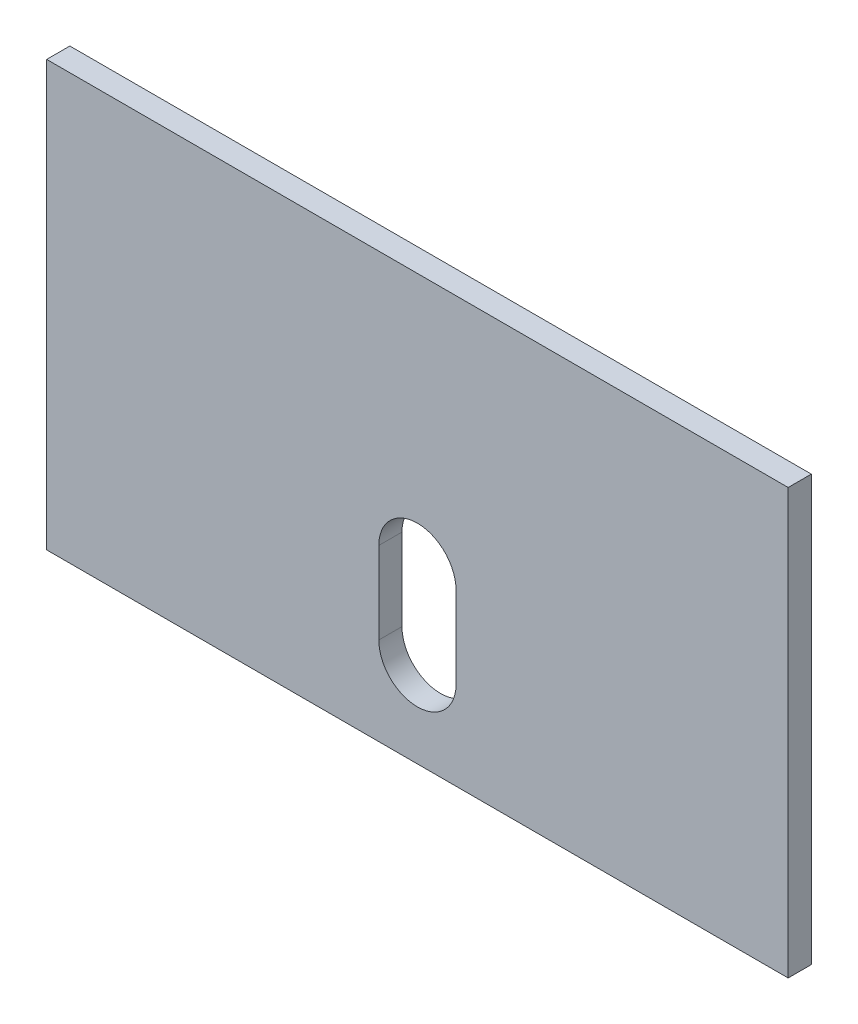
ISO-10303-21;
HEADER;
FILE_DESCRIPTION(('STEP AP214'),'2;1');
FILE_NAME('part.step','',(''),(''),'','','');
FILE_SCHEMA(('AUTOMOTIVE_DESIGN { 1 0 10303 214 1 1 1 1 }'));
ENDSEC;
DATA;
#1=APPLICATION_CONTEXT('core data for automotive mechanical design processes');
#2=APPLICATION_PROTOCOL_DEFINITION('international standard','automotive_design',2000,#1);
#3=PRODUCT_CONTEXT('',#1,'mechanical');
#4=PRODUCT('Part','Part','',(#3));
#5=PRODUCT_RELATED_PRODUCT_CATEGORY('part','',(#4));
#6=PRODUCT_DEFINITION_FORMATION('','',#4);
#7=PRODUCT_DEFINITION_CONTEXT('part definition',#1,'design');
#8=PRODUCT_DEFINITION('design','',#6,#7);
#9=PRODUCT_DEFINITION_SHAPE('','',#8);
#10=(LENGTH_UNIT() NAMED_UNIT(*) SI_UNIT(.MILLI.,.METRE.));
#11=(NAMED_UNIT(*) PLANE_ANGLE_UNIT() SI_UNIT($,.RADIAN.));
#12=(NAMED_UNIT(*) SI_UNIT($,.STERADIAN.) SOLID_ANGLE_UNIT());
#13=UNCERTAINTY_MEASURE_WITH_UNIT(LENGTH_MEASURE(1.E-05),#10,'distance_accuracy_value','');
#14=(GEOMETRIC_REPRESENTATION_CONTEXT(3) GLOBAL_UNCERTAINTY_ASSIGNED_CONTEXT((#13)) GLOBAL_UNIT_ASSIGNED_CONTEXT((#10,
#11,#12)) REPRESENTATION_CONTEXT('',''));
#15=CARTESIAN_POINT('',(0.,0.,0.));
#16=DIRECTION('',(0.,0.,1.));
#17=DIRECTION('',(1.,0.,0.));
#18=AXIS2_PLACEMENT_3D('',#15,#16,#17);
#19=CARTESIAN_POINT('',(0.,0.,1.5));
#20=DIRECTION('',(0.,0.,1.));
#21=DIRECTION('',(1.,0.,0.));
#22=AXIS2_PLACEMENT_3D('',#19,#20,#21);
#23=PLANE('',#22);
#24=DIRECTION('',(0.,-1.,0.));
#25=VECTOR('',#24,1.);
#26=CARTESIAN_POINT('',(-48.,-27.5,1.5));
#27=LINE('',#26,#25);
#28=CARTESIAN_POINT('',(-48.,27.5,1.5));
#29=VERTEX_POINT('',#28);
#30=CARTESIAN_POINT('',(-48.,-27.5,1.5));
#31=VERTEX_POINT('',#30);
#32=EDGE_CURVE('E163',#29,#31,#27,.T.);
#33=ORIENTED_EDGE('',*,*,#32,.T.);
#34=DIRECTION('',(1.,0.,0.));
#35=VECTOR('',#34,1.);
#36=CARTESIAN_POINT('',(48.,-27.5,1.5));
#37=LINE('',#36,#35);
#38=CARTESIAN_POINT('',(48.,-27.5,1.5));
#39=VERTEX_POINT('',#38);
#40=EDGE_CURVE('E167',#31,#39,#37,.T.);
#41=ORIENTED_EDGE('',*,*,#40,.T.);
#42=DIRECTION('',(0.,1.,0.));
#43=VECTOR('',#42,1.);
#44=CARTESIAN_POINT('',(48.,-27.5,1.5));
#45=LINE('',#44,#43);
#46=CARTESIAN_POINT('',(48.,27.5,1.5));
#47=VERTEX_POINT('',#46);
#48=EDGE_CURVE('E171',#39,#47,#45,.T.);
#49=ORIENTED_EDGE('',*,*,#48,.T.);
#50=DIRECTION('',(-1.,0.,0.));
#51=VECTOR('',#50,1.);
#52=CARTESIAN_POINT('',(48.,27.5,1.5));
#53=LINE('',#52,#51);
#54=EDGE_CURVE('E174',#47,#29,#53,.T.);
#55=ORIENTED_EDGE('',*,*,#54,.T.);
#56=EDGE_LOOP('',(#33,#41,#49,#55));
#57=FACE_BOUND('',#56,.T.);
#58=DIRECTION('',(0.,1.,0.));
#59=VECTOR('',#58,1.);
#60=CARTESIAN_POINT('',(5.,-16.1,1.5));
#61=LINE('',#60,#59);
#62=CARTESIAN_POINT('',(5.,-16.1,1.5));
#63=VERTEX_POINT('',#62);
#64=CARTESIAN_POINT('',(5.,-5.50000000000001,1.5));
#65=VERTEX_POINT('',#64);
#66=EDGE_CURVE('E123',#63,#65,#61,.T.);
#67=ORIENTED_EDGE('',*,*,#66,.F.);
#68=CARTESIAN_POINT('',(0.,-16.1,1.5));
#69=DIRECTION('',(0.,0.,1.));
#70=DIRECTION('',(1.,0.,0.));
#71=AXIS2_PLACEMENT_3D('',#68,#69,#70);
#72=CIRCLE('',#71,5.);
#73=CARTESIAN_POINT('',(-5.,-16.1,1.5));
#74=VERTEX_POINT('',#73);
#75=EDGE_CURVE('E114',#74,#63,#72,.T.);
#76=ORIENTED_EDGE('',*,*,#75,.F.);
#77=DIRECTION('',(0.,-1.,0.));
#78=VECTOR('',#77,1.);
#79=CARTESIAN_POINT('',(-5.,-16.1,1.5));
#80=LINE('',#79,#78);
#81=CARTESIAN_POINT('',(-5.,-5.50000000000001,1.5));
#82=VERTEX_POINT('',#81);
#83=EDGE_CURVE('E141',#82,#74,#80,.T.);
#84=ORIENTED_EDGE('',*,*,#83,.F.);
#85=CARTESIAN_POINT('',(0.,-5.50000000000001,1.5));
#86=DIRECTION('',(0.,0.,1.));
#87=DIRECTION('',(1.,0.,0.));
#88=AXIS2_PLACEMENT_3D('',#85,#86,#87);
#89=CIRCLE('',#88,5.);
#90=EDGE_CURVE('E136',#65,#82,#89,.T.);
#91=ORIENTED_EDGE('',*,*,#90,.F.);
#92=EDGE_LOOP('',(#67,#76,#84,#91));
#93=FACE_BOUND('',#92,.T.);
#94=ADVANCED_FACE('F48',(#57,#93),#23,.T.);
#95=CARTESIAN_POINT('',(0.,0.,-1.5));
#96=DIRECTION('',(0.,0.,1.));
#97=DIRECTION('',(1.,0.,0.));
#98=AXIS2_PLACEMENT_3D('',#95,#96,#97);
#99=PLANE('',#98);
#100=DIRECTION('',(0.,-1.,0.));
#101=VECTOR('',#100,1.);
#102=CARTESIAN_POINT('',(-48.,-27.5,-1.5));
#103=LINE('',#102,#101);
#104=CARTESIAN_POINT('',(-48.,27.5,-1.5));
#105=VERTEX_POINT('',#104);
#106=CARTESIAN_POINT('',(-48.,-27.5,-1.5));
#107=VERTEX_POINT('',#106);
#108=EDGE_CURVE('E132',#105,#107,#103,.T.);
#109=ORIENTED_EDGE('',*,*,#108,.F.);
#110=DIRECTION('',(-1.,0.,0.));
#111=VECTOR('',#110,1.);
#112=CARTESIAN_POINT('',(48.,27.5,-1.5));
#113=LINE('',#112,#111);
#114=CARTESIAN_POINT('',(48.,27.5,-1.5));
#115=VERTEX_POINT('',#114);
#116=EDGE_CURVE('E168',#115,#105,#113,.T.);
#117=ORIENTED_EDGE('',*,*,#116,.F.);
#118=DIRECTION('',(0.,1.,0.));
#119=VECTOR('',#118,1.);
#120=CARTESIAN_POINT('',(48.,-27.5,-1.5));
#121=LINE('',#120,#119);
#122=CARTESIAN_POINT('',(48.,-27.5,-1.5));
#123=VERTEX_POINT('',#122);
#124=EDGE_CURVE('E184',#123,#115,#121,.T.);
#125=ORIENTED_EDGE('',*,*,#124,.F.);
#126=DIRECTION('',(1.,0.,0.));
#127=VECTOR('',#126,1.);
#128=CARTESIAN_POINT('',(48.,-27.5,-1.5));
#129=LINE('',#128,#127);
#130=EDGE_CURVE('E181',#107,#123,#129,.T.);
#131=ORIENTED_EDGE('',*,*,#130,.F.);
#132=EDGE_LOOP('',(#109,#117,#125,#131));
#133=FACE_BOUND('',#132,.T.);
#134=CARTESIAN_POINT('',(0.,-16.1,-1.5));
#135=DIRECTION('',(0.,0.,1.));
#136=DIRECTION('',(1.,0.,0.));
#137=AXIS2_PLACEMENT_3D('',#134,#135,#136);
#138=CIRCLE('',#137,5.);
#139=CARTESIAN_POINT('',(-5.,-16.1,-1.5));
#140=VERTEX_POINT('',#139);
#141=CARTESIAN_POINT('',(5.,-16.1,-1.5));
#142=VERTEX_POINT('',#141);
#143=EDGE_CURVE('E72',#140,#142,#138,.T.);
#144=ORIENTED_EDGE('',*,*,#143,.T.);
#145=DIRECTION('',(0.,1.,0.));
#146=VECTOR('',#145,1.);
#147=CARTESIAN_POINT('',(5.,-16.1,-1.5));
#148=LINE('',#147,#146);
#149=CARTESIAN_POINT('',(5.,-5.50000000000001,-1.5));
#150=VERTEX_POINT('',#149);
#151=EDGE_CURVE('E130',#142,#150,#148,.T.);
#152=ORIENTED_EDGE('',*,*,#151,.T.);
#153=CARTESIAN_POINT('',(0.,-5.50000000000001,-1.5));
#154=DIRECTION('',(0.,0.,1.));
#155=DIRECTION('',(1.,0.,0.));
#156=AXIS2_PLACEMENT_3D('',#153,#154,#155);
#157=CIRCLE('',#156,5.);
#158=CARTESIAN_POINT('',(-5.,-5.50000000000001,-1.5));
#159=VERTEX_POINT('',#158);
#160=EDGE_CURVE('E150',#150,#159,#157,.T.);
#161=ORIENTED_EDGE('',*,*,#160,.T.);
#162=DIRECTION('',(0.,-1.,0.));
#163=VECTOR('',#162,1.);
#164=CARTESIAN_POINT('',(-5.,-16.1,-1.5));
#165=LINE('',#164,#163);
#166=EDGE_CURVE('E124',#159,#140,#165,.T.);
#167=ORIENTED_EDGE('',*,*,#166,.T.);
#168=EDGE_LOOP('',(#144,#152,#161,#167));
#169=FACE_BOUND('',#168,.T.);
#170=ADVANCED_FACE('F208',(#133,#169),#99,.F.);
#171=CARTESIAN_POINT('',(-48.,-27.5,1.5));
#172=DIRECTION('',(1.,0.,0.));
#173=DIRECTION('',(0.,0.,-1.));
#174=AXIS2_PLACEMENT_3D('',#171,#172,#173);
#175=PLANE('',#174);
#176=ORIENTED_EDGE('',*,*,#108,.T.);
#177=DIRECTION('',(0.,0.,-1.));
#178=VECTOR('',#177,1.);
#179=CARTESIAN_POINT('',(-48.,-27.5,1.5));
#180=LINE('',#179,#178);
#181=EDGE_CURVE('E13',#31,#107,#180,.T.);
#182=ORIENTED_EDGE('',*,*,#181,.F.);
#183=ORIENTED_EDGE('',*,*,#32,.F.);
#184=DIRECTION('',(0.,0.,-1.));
#185=VECTOR('',#184,1.);
#186=CARTESIAN_POINT('',(-48.,27.5,1.5));
#187=LINE('',#186,#185);
#188=EDGE_CURVE('E177',#29,#105,#187,.T.);
#189=ORIENTED_EDGE('',*,*,#188,.T.);
#190=EDGE_LOOP('',(#176,#182,#183,#189));
#191=FACE_BOUND('',#190,.T.);
#192=ADVANCED_FACE('F50',(#191),#175,.F.);
#193=CARTESIAN_POINT('',(48.,-27.5,1.5));
#194=DIRECTION('',(0.,1.,0.));
#195=DIRECTION('',(-1.,0.,0.));
#196=AXIS2_PLACEMENT_3D('',#193,#194,#195);
#197=PLANE('',#196);
#198=ORIENTED_EDGE('',*,*,#130,.T.);
#199=DIRECTION('',(0.,0.,-1.));
#200=VECTOR('',#199,1.);
#201=CARTESIAN_POINT('',(48.,-27.5,1.5));
#202=LINE('',#201,#200);
#203=EDGE_CURVE('E57',#39,#123,#202,.T.);
#204=ORIENTED_EDGE('',*,*,#203,.F.);
#205=ORIENTED_EDGE('',*,*,#40,.F.);
#206=ORIENTED_EDGE('',*,*,#181,.T.);
#207=EDGE_LOOP('',(#198,#204,#205,#206));
#208=FACE_BOUND('',#207,.T.);
#209=ADVANCED_FACE('F218',(#208),#197,.F.);
#210=CARTESIAN_POINT('',(48.,-27.5,1.5));
#211=DIRECTION('',(-1.,0.,0.));
#212=DIRECTION('',(0.,0.,1.));
#213=AXIS2_PLACEMENT_3D('',#210,#211,#212);
#214=PLANE('',#213);
#215=ORIENTED_EDGE('',*,*,#124,.T.);
#216=DIRECTION('',(0.,0.,-1.));
#217=VECTOR('',#216,1.);
#218=CARTESIAN_POINT('',(48.,27.5,1.5));
#219=LINE('',#218,#217);
#220=EDGE_CURVE('E192',#47,#115,#219,.T.);
#221=ORIENTED_EDGE('',*,*,#220,.F.);
#222=ORIENTED_EDGE('',*,*,#48,.F.);
#223=ORIENTED_EDGE('',*,*,#203,.T.);
#224=EDGE_LOOP('',(#215,#221,#222,#223));
#225=FACE_BOUND('',#224,.T.);
#226=ADVANCED_FACE('F202',(#225),#214,.F.);
#227=CARTESIAN_POINT('',(48.,27.5,1.5));
#228=DIRECTION('',(0.,-1.,0.));
#229=DIRECTION('',(1.,0.,0.));
#230=AXIS2_PLACEMENT_3D('',#227,#228,#229);
#231=PLANE('',#230);
#232=ORIENTED_EDGE('',*,*,#116,.T.);
#233=ORIENTED_EDGE('',*,*,#188,.F.);
#234=ORIENTED_EDGE('',*,*,#54,.F.);
#235=ORIENTED_EDGE('',*,*,#220,.T.);
#236=EDGE_LOOP('',(#232,#233,#234,#235));
#237=FACE_BOUND('',#236,.T.);
#238=ADVANCED_FACE('F212',(#237),#231,.F.);
#239=CARTESIAN_POINT('',(0.,-16.1,1.5));
#240=DIRECTION('',(0.,0.,-1.));
#241=DIRECTION('',(-1.,0.,0.));
#242=AXIS2_PLACEMENT_3D('',#239,#240,#241);
#243=CYLINDRICAL_SURFACE('',#242,5.);
#244=ORIENTED_EDGE('',*,*,#143,.F.);
#245=DIRECTION('',(0.,0.,-1.));
#246=VECTOR('',#245,1.);
#247=CARTESIAN_POINT('',(-5.,-16.1,1.5));
#248=LINE('',#247,#246);
#249=EDGE_CURVE('E118',#74,#140,#248,.T.);
#250=ORIENTED_EDGE('',*,*,#249,.F.);
#251=ORIENTED_EDGE('',*,*,#75,.T.);
#252=DIRECTION('',(0.,0.,-1.));
#253=VECTOR('',#252,1.);
#254=CARTESIAN_POINT('',(5.,-16.1,1.5));
#255=LINE('',#254,#253);
#256=EDGE_CURVE('E117',#63,#142,#255,.T.);
#257=ORIENTED_EDGE('',*,*,#256,.T.);
#258=EDGE_LOOP('',(#244,#250,#251,#257));
#259=FACE_BOUND('',#258,.T.);
#260=ADVANCED_FACE('F116',(#259),#243,.F.);
#261=CARTESIAN_POINT('',(5.,-16.1,1.5));
#262=DIRECTION('',(-1.,0.,0.));
#263=DIRECTION('',(0.,0.,1.));
#264=AXIS2_PLACEMENT_3D('',#261,#262,#263);
#265=PLANE('',#264);
#266=ORIENTED_EDGE('',*,*,#151,.F.);
#267=ORIENTED_EDGE('',*,*,#256,.F.);
#268=ORIENTED_EDGE('',*,*,#66,.T.);
#269=DIRECTION('',(0.,0.,-1.));
#270=VECTOR('',#269,1.);
#271=CARTESIAN_POINT('',(5.,-5.50000000000001,1.5));
#272=LINE('',#271,#270);
#273=EDGE_CURVE('E133',#65,#150,#272,.T.);
#274=ORIENTED_EDGE('',*,*,#273,.T.);
#275=EDGE_LOOP('',(#266,#267,#268,#274));
#276=FACE_BOUND('',#275,.T.);
#277=ADVANCED_FACE('F127',(#276),#265,.T.);
#278=CARTESIAN_POINT('',(0.,-5.50000000000001,1.5));
#279=DIRECTION('',(0.,0.,-1.));
#280=DIRECTION('',(-1.,0.,0.));
#281=AXIS2_PLACEMENT_3D('',#278,#279,#280);
#282=CYLINDRICAL_SURFACE('',#281,5.);
#283=ORIENTED_EDGE('',*,*,#160,.F.);
#284=ORIENTED_EDGE('',*,*,#273,.F.);
#285=ORIENTED_EDGE('',*,*,#90,.T.);
#286=DIRECTION('',(0.,0.,-1.));
#287=VECTOR('',#286,1.);
#288=CARTESIAN_POINT('',(-5.,-5.50000000000001,1.5));
#289=LINE('',#288,#287);
#290=EDGE_CURVE('E64',#82,#159,#289,.T.);
#291=ORIENTED_EDGE('',*,*,#290,.T.);
#292=EDGE_LOOP('',(#283,#284,#285,#291));
#293=FACE_BOUND('',#292,.T.);
#294=ADVANCED_FACE('F241',(#293),#282,.F.);
#295=CARTESIAN_POINT('',(-5.,-16.1,1.5));
#296=DIRECTION('',(1.,0.,0.));
#297=DIRECTION('',(0.,0.,-1.));
#298=AXIS2_PLACEMENT_3D('',#295,#296,#297);
#299=PLANE('',#298);
#300=ORIENTED_EDGE('',*,*,#166,.F.);
#301=ORIENTED_EDGE('',*,*,#290,.F.);
#302=ORIENTED_EDGE('',*,*,#83,.T.);
#303=ORIENTED_EDGE('',*,*,#249,.T.);
#304=EDGE_LOOP('',(#300,#301,#302,#303));
#305=FACE_BOUND('',#304,.T.);
#306=ADVANCED_FACE('F245',(#305),#299,.T.);
#307=CLOSED_SHELL('',(#94,#170,#192,#209,#226,#238,#260,#277,#294,#306));
#308=MANIFOLD_SOLID_BREP('B2',#307);
#309=ADVANCED_BREP_SHAPE_REPRESENTATION('',(#18,#308),#14);
#310=SHAPE_DEFINITION_REPRESENTATION(#9,#309);
ENDSEC;
END-ISO-10303-21;
